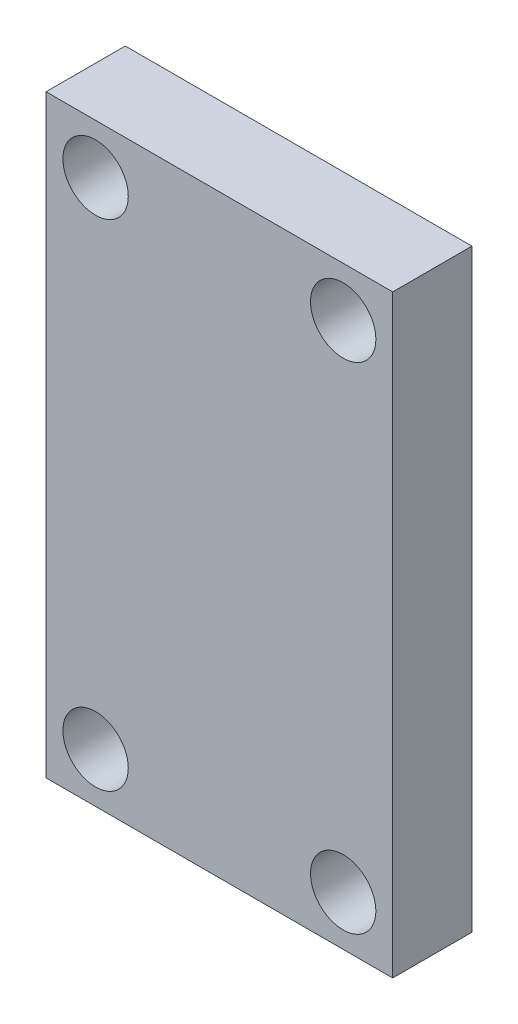
ISO-10303-21;
HEADER;
FILE_DESCRIPTION(('STEP AP214'),'2;1');
FILE_NAME('part.step','',(''),(''),'','','');
FILE_SCHEMA(('AUTOMOTIVE_DESIGN { 1 0 10303 214 1 1 1 1 }'));
ENDSEC;
DATA;
#1=APPLICATION_CONTEXT('core data for automotive mechanical design processes');
#2=APPLICATION_PROTOCOL_DEFINITION('international standard','automotive_design',2000,#1);
#3=PRODUCT_CONTEXT('',#1,'mechanical');
#4=PRODUCT('Part','Part','',(#3));
#5=PRODUCT_RELATED_PRODUCT_CATEGORY('part','',(#4));
#6=PRODUCT_DEFINITION_FORMATION('','',#4);
#7=PRODUCT_DEFINITION_CONTEXT('part definition',#1,'design');
#8=PRODUCT_DEFINITION('design','',#6,#7);
#9=PRODUCT_DEFINITION_SHAPE('','',#8);
#10=(LENGTH_UNIT() NAMED_UNIT(*) SI_UNIT(.MILLI.,.METRE.));
#11=(NAMED_UNIT(*) PLANE_ANGLE_UNIT() SI_UNIT($,.RADIAN.));
#12=(NAMED_UNIT(*) SI_UNIT($,.STERADIAN.) SOLID_ANGLE_UNIT());
#13=UNCERTAINTY_MEASURE_WITH_UNIT(LENGTH_MEASURE(1.E-05),#10,'distance_accuracy_value','');
#14=(GEOMETRIC_REPRESENTATION_CONTEXT(3) GLOBAL_UNCERTAINTY_ASSIGNED_CONTEXT((#13)) GLOBAL_UNIT_ASSIGNED_CONTEXT((#10,
#11,#12)) REPRESENTATION_CONTEXT('',''));
#15=CARTESIAN_POINT('',(0.,0.,0.));
#16=DIRECTION('',(0.,0.,1.));
#17=DIRECTION('',(1.,0.,0.));
#18=AXIS2_PLACEMENT_3D('',#15,#16,#17);
#19=CARTESIAN_POINT('',(17.5,30.,4.));
#20=DIRECTION('',(-1.,0.,0.));
#21=DIRECTION('',(0.,0.,1.));
#22=AXIS2_PLACEMENT_3D('',#19,#20,#21);
#23=PLANE('',#22);
#24=DIRECTION('',(0.,1.,0.));
#25=VECTOR('',#24,1.);
#26=CARTESIAN_POINT('',(17.5,30.,-4.));
#27=LINE('',#26,#25);
#28=CARTESIAN_POINT('',(17.5,-30.,-4.));
#29=VERTEX_POINT('',#28);
#30=CARTESIAN_POINT('',(17.5,30.,-4.));
#31=VERTEX_POINT('',#30);
#32=EDGE_CURVE('E104',#29,#31,#27,.T.);
#33=ORIENTED_EDGE('',*,*,#32,.T.);
#34=DIRECTION('',(0.,0.,-1.));
#35=VECTOR('',#34,1.);
#36=CARTESIAN_POINT('',(17.5,30.,4.));
#37=LINE('',#36,#35);
#38=CARTESIAN_POINT('',(17.5,30.,4.));
#39=VERTEX_POINT('',#38);
#40=EDGE_CURVE('E11',#39,#31,#37,.T.);
#41=ORIENTED_EDGE('',*,*,#40,.F.);
#42=DIRECTION('',(0.,1.,0.));
#43=VECTOR('',#42,1.);
#44=CARTESIAN_POINT('',(17.5,30.,4.));
#45=LINE('',#44,#43);
#46=CARTESIAN_POINT('',(17.5,-30.,4.));
#47=VERTEX_POINT('',#46);
#48=EDGE_CURVE('E92',#47,#39,#45,.T.);
#49=ORIENTED_EDGE('',*,*,#48,.F.);
#50=DIRECTION('',(0.,0.,-1.));
#51=VECTOR('',#50,1.);
#52=CARTESIAN_POINT('',(17.5,-30.,4.));
#53=LINE('',#52,#51);
#54=EDGE_CURVE('E100',#47,#29,#53,.T.);
#55=ORIENTED_EDGE('',*,*,#54,.T.);
#56=EDGE_LOOP('',(#33,#41,#49,#55));
#57=FACE_BOUND('',#56,.T.);
#58=ADVANCED_FACE('F41',(#57),#23,.F.);
#59=CARTESIAN_POINT('',(-17.5,30.,4.));
#60=DIRECTION('',(0.,-1.,0.));
#61=DIRECTION('',(0.,0.,-1.));
#62=AXIS2_PLACEMENT_3D('',#59,#60,#61);
#63=PLANE('',#62);
#64=DIRECTION('',(-1.,0.,0.));
#65=VECTOR('',#64,1.);
#66=CARTESIAN_POINT('',(-17.5,30.,-4.));
#67=LINE('',#66,#65);
#68=CARTESIAN_POINT('',(-17.5,30.,-4.));
#69=VERTEX_POINT('',#68);
#70=EDGE_CURVE('E96',#31,#69,#67,.T.);
#71=ORIENTED_EDGE('',*,*,#70,.T.);
#72=DIRECTION('',(0.,0.,-1.));
#73=VECTOR('',#72,1.);
#74=CARTESIAN_POINT('',(-17.5,30.,4.));
#75=LINE('',#74,#73);
#76=CARTESIAN_POINT('',(-17.5,30.,4.));
#77=VERTEX_POINT('',#76);
#78=EDGE_CURVE('E49',#77,#69,#75,.T.);
#79=ORIENTED_EDGE('',*,*,#78,.F.);
#80=DIRECTION('',(-1.,0.,0.));
#81=VECTOR('',#80,1.);
#82=CARTESIAN_POINT('',(-17.5,30.,4.));
#83=LINE('',#82,#81);
#84=EDGE_CURVE('E87',#39,#77,#83,.T.);
#85=ORIENTED_EDGE('',*,*,#84,.F.);
#86=ORIENTED_EDGE('',*,*,#40,.T.);
#87=EDGE_LOOP('',(#71,#79,#85,#86));
#88=FACE_BOUND('',#87,.T.);
#89=ADVANCED_FACE('F95',(#88),#63,.F.);
#90=CARTESIAN_POINT('',(-17.5,30.,4.));
#91=DIRECTION('',(1.,0.,0.));
#92=DIRECTION('',(0.,0.,-1.));
#93=AXIS2_PLACEMENT_3D('',#90,#91,#92);
#94=PLANE('',#93);
#95=DIRECTION('',(0.,-1.,0.));
#96=VECTOR('',#95,1.);
#97=CARTESIAN_POINT('',(-17.5,30.,-4.));
#98=LINE('',#97,#96);
#99=CARTESIAN_POINT('',(-17.5,-30.,-4.));
#100=VERTEX_POINT('',#99);
#101=EDGE_CURVE('E74',#69,#100,#98,.T.);
#102=ORIENTED_EDGE('',*,*,#101,.T.);
#103=DIRECTION('',(0.,0.,-1.));
#104=VECTOR('',#103,1.);
#105=CARTESIAN_POINT('',(-17.5,-30.,4.));
#106=LINE('',#105,#104);
#107=CARTESIAN_POINT('',(-17.5,-30.,4.));
#108=VERTEX_POINT('',#107);
#109=EDGE_CURVE('E97',#108,#100,#106,.T.);
#110=ORIENTED_EDGE('',*,*,#109,.F.);
#111=DIRECTION('',(0.,-1.,0.));
#112=VECTOR('',#111,1.);
#113=CARTESIAN_POINT('',(-17.5,30.,4.));
#114=LINE('',#113,#112);
#115=EDGE_CURVE('E90',#77,#108,#114,.T.);
#116=ORIENTED_EDGE('',*,*,#115,.F.);
#117=ORIENTED_EDGE('',*,*,#78,.T.);
#118=EDGE_LOOP('',(#102,#110,#116,#117));
#119=FACE_BOUND('',#118,.T.);
#120=ADVANCED_FACE('F98',(#119),#94,.F.);
#121=CARTESIAN_POINT('',(-17.5,-30.,4.));
#122=DIRECTION('',(0.,1.,0.));
#123=DIRECTION('',(0.,0.,1.));
#124=AXIS2_PLACEMENT_3D('',#121,#122,#123);
#125=PLANE('',#124);
#126=DIRECTION('',(1.,0.,0.));
#127=VECTOR('',#126,1.);
#128=CARTESIAN_POINT('',(-17.5,-30.,-4.));
#129=LINE('',#128,#127);
#130=EDGE_CURVE('E80',#100,#29,#129,.T.);
#131=ORIENTED_EDGE('',*,*,#130,.T.);
#132=ORIENTED_EDGE('',*,*,#54,.F.);
#133=DIRECTION('',(1.,0.,0.));
#134=VECTOR('',#133,1.);
#135=CARTESIAN_POINT('',(-17.5,-30.,4.));
#136=LINE('',#135,#134);
#137=EDGE_CURVE('E57',#108,#47,#136,.T.);
#138=ORIENTED_EDGE('',*,*,#137,.F.);
#139=ORIENTED_EDGE('',*,*,#109,.T.);
#140=EDGE_LOOP('',(#131,#132,#138,#139));
#141=FACE_BOUND('',#140,.T.);
#142=ADVANCED_FACE('F112',(#141),#125,.F.);
#143=CARTESIAN_POINT('',(0.,0.,4.));
#144=DIRECTION('',(0.,0.,1.));
#145=DIRECTION('',(1.,0.,0.));
#146=AXIS2_PLACEMENT_3D('',#143,#144,#145);
#147=PLANE('',#146);
#148=CARTESIAN_POINT('',(-12.5,-25.,4.));
#149=DIRECTION('',(0.,0.,1.));
#150=DIRECTION('',(1.,0.,0.));
#151=AXIS2_PLACEMENT_3D('',#148,#149,#150);
#152=CIRCLE('',#151,3.3);
#153=CARTESIAN_POINT('',(-9.2,-25.,4.));
#154=VERTEX_POINT('',#153);
#155=EDGE_CURVE('E138',#154,#154,#152,.T.);
#156=ORIENTED_EDGE('',*,*,#155,.F.);
#157=EDGE_LOOP('',(#156));
#158=FACE_BOUND('',#157,.T.);
#159=CARTESIAN_POINT('',(12.5,-25.,4.));
#160=DIRECTION('',(0.,0.,1.));
#161=DIRECTION('',(1.,0.,0.));
#162=AXIS2_PLACEMENT_3D('',#159,#160,#161);
#163=CIRCLE('',#162,3.3);
#164=CARTESIAN_POINT('',(15.8,-25.,4.));
#165=VERTEX_POINT('',#164);
#166=EDGE_CURVE('E132',#165,#165,#163,.T.);
#167=ORIENTED_EDGE('',*,*,#166,.F.);
#168=EDGE_LOOP('',(#167));
#169=FACE_BOUND('',#168,.T.);
#170=CARTESIAN_POINT('',(12.5,25.,4.));
#171=DIRECTION('',(0.,0.,1.));
#172=DIRECTION('',(1.,0.,0.));
#173=AXIS2_PLACEMENT_3D('',#170,#171,#172);
#174=CIRCLE('',#173,3.3);
#175=CARTESIAN_POINT('',(15.8,25.,4.));
#176=VERTEX_POINT('',#175);
#177=EDGE_CURVE('E126',#176,#176,#174,.T.);
#178=ORIENTED_EDGE('',*,*,#177,.F.);
#179=EDGE_LOOP('',(#178));
#180=FACE_BOUND('',#179,.T.);
#181=CARTESIAN_POINT('',(-12.5,25.,4.));
#182=DIRECTION('',(0.,0.,1.));
#183=DIRECTION('',(1.,0.,0.));
#184=AXIS2_PLACEMENT_3D('',#181,#182,#183);
#185=CIRCLE('',#184,3.3);
#186=CARTESIAN_POINT('',(-9.2,25.,4.));
#187=VERTEX_POINT('',#186);
#188=EDGE_CURVE('E120',#187,#187,#185,.T.);
#189=ORIENTED_EDGE('',*,*,#188,.F.);
#190=EDGE_LOOP('',(#189));
#191=FACE_BOUND('',#190,.T.);
#192=ORIENTED_EDGE('',*,*,#48,.T.);
#193=ORIENTED_EDGE('',*,*,#84,.T.);
#194=ORIENTED_EDGE('',*,*,#115,.T.);
#195=ORIENTED_EDGE('',*,*,#137,.T.);
#196=EDGE_LOOP('',(#192,#193,#194,#195));
#197=FACE_BOUND('',#196,.T.);
#198=ADVANCED_FACE('F88',(#158,#169,#180,#191,#197),#147,.T.);
#199=CARTESIAN_POINT('',(0.,0.,-4.));
#200=DIRECTION('',(0.,0.,1.));
#201=DIRECTION('',(1.,0.,0.));
#202=AXIS2_PLACEMENT_3D('',#199,#200,#201);
#203=PLANE('',#202);
#204=CARTESIAN_POINT('',(-12.5,-25.,-4.));
#205=DIRECTION('',(0.,0.,1.));
#206=DIRECTION('',(1.,0.,0.));
#207=AXIS2_PLACEMENT_3D('',#204,#205,#206);
#208=CIRCLE('',#207,3.3);
#209=CARTESIAN_POINT('',(-9.2,-25.,-4.));
#210=VERTEX_POINT('',#209);
#211=EDGE_CURVE('E135',#210,#210,#208,.T.);
#212=ORIENTED_EDGE('',*,*,#211,.T.);
#213=EDGE_LOOP('',(#212));
#214=FACE_BOUND('',#213,.T.);
#215=CARTESIAN_POINT('',(12.5,-25.,-4.));
#216=DIRECTION('',(0.,0.,1.));
#217=DIRECTION('',(1.,0.,0.));
#218=AXIS2_PLACEMENT_3D('',#215,#216,#217);
#219=CIRCLE('',#218,3.3);
#220=CARTESIAN_POINT('',(15.8,-25.,-4.));
#221=VERTEX_POINT('',#220);
#222=EDGE_CURVE('E129',#221,#221,#219,.T.);
#223=ORIENTED_EDGE('',*,*,#222,.T.);
#224=EDGE_LOOP('',(#223));
#225=FACE_BOUND('',#224,.T.);
#226=CARTESIAN_POINT('',(12.5,25.,-4.));
#227=DIRECTION('',(0.,0.,1.));
#228=DIRECTION('',(1.,0.,0.));
#229=AXIS2_PLACEMENT_3D('',#226,#227,#228);
#230=CIRCLE('',#229,3.3);
#231=CARTESIAN_POINT('',(15.8,25.,-4.));
#232=VERTEX_POINT('',#231);
#233=EDGE_CURVE('E123',#232,#232,#230,.T.);
#234=ORIENTED_EDGE('',*,*,#233,.T.);
#235=EDGE_LOOP('',(#234));
#236=FACE_BOUND('',#235,.T.);
#237=CARTESIAN_POINT('',(-12.5,25.,-4.));
#238=DIRECTION('',(0.,0.,1.));
#239=DIRECTION('',(1.,0.,0.));
#240=AXIS2_PLACEMENT_3D('',#237,#238,#239);
#241=CIRCLE('',#240,3.3);
#242=CARTESIAN_POINT('',(-9.2,25.,-4.));
#243=VERTEX_POINT('',#242);
#244=EDGE_CURVE('E107',#243,#243,#241,.T.);
#245=ORIENTED_EDGE('',*,*,#244,.T.);
#246=EDGE_LOOP('',(#245));
#247=FACE_BOUND('',#246,.T.);
#248=ORIENTED_EDGE('',*,*,#32,.F.);
#249=ORIENTED_EDGE('',*,*,#130,.F.);
#250=ORIENTED_EDGE('',*,*,#101,.F.);
#251=ORIENTED_EDGE('',*,*,#70,.F.);
#252=EDGE_LOOP('',(#248,#249,#250,#251));
#253=FACE_BOUND('',#252,.T.);
#254=ADVANCED_FACE('F115',(#214,#225,#236,#247,#253),#203,.F.);
#255=CARTESIAN_POINT('',(-12.5,25.,4.));
#256=DIRECTION('',(0.,0.,1.));
#257=DIRECTION('',(1.,0.,0.));
#258=AXIS2_PLACEMENT_3D('',#255,#256,#257);
#259=CYLINDRICAL_SURFACE('',#258,3.3);
#260=ORIENTED_EDGE('',*,*,#244,.F.);
#261=EDGE_LOOP('',(#260));
#262=FACE_BOUND('',#261,.T.);
#263=ORIENTED_EDGE('',*,*,#188,.T.);
#264=EDGE_LOOP('',(#263));
#265=FACE_BOUND('',#264,.T.);
#266=ADVANCED_FACE('F153',(#262,#265),#259,.F.);
#267=CARTESIAN_POINT('',(12.5,25.,4.));
#268=DIRECTION('',(0.,0.,1.));
#269=DIRECTION('',(1.,0.,0.));
#270=AXIS2_PLACEMENT_3D('',#267,#268,#269);
#271=CYLINDRICAL_SURFACE('',#270,3.3);
#272=ORIENTED_EDGE('',*,*,#233,.F.);
#273=EDGE_LOOP('',(#272));
#274=FACE_BOUND('',#273,.T.);
#275=ORIENTED_EDGE('',*,*,#177,.T.);
#276=EDGE_LOOP('',(#275));
#277=FACE_BOUND('',#276,.T.);
#278=ADVANCED_FACE('F155',(#274,#277),#271,.F.);
#279=CARTESIAN_POINT('',(12.5,-25.,4.));
#280=DIRECTION('',(0.,0.,1.));
#281=DIRECTION('',(1.,0.,0.));
#282=AXIS2_PLACEMENT_3D('',#279,#280,#281);
#283=CYLINDRICAL_SURFACE('',#282,3.3);
#284=ORIENTED_EDGE('',*,*,#222,.F.);
#285=EDGE_LOOP('',(#284));
#286=FACE_BOUND('',#285,.T.);
#287=ORIENTED_EDGE('',*,*,#166,.T.);
#288=EDGE_LOOP('',(#287));
#289=FACE_BOUND('',#288,.T.);
#290=ADVANCED_FACE('F162',(#286,#289),#283,.F.);
#291=CARTESIAN_POINT('',(-12.5,-25.,4.));
#292=DIRECTION('',(0.,0.,1.));
#293=DIRECTION('',(1.,0.,0.));
#294=AXIS2_PLACEMENT_3D('',#291,#292,#293);
#295=CYLINDRICAL_SURFACE('',#294,3.3);
#296=ORIENTED_EDGE('',*,*,#211,.F.);
#297=EDGE_LOOP('',(#296));
#298=FACE_BOUND('',#297,.T.);
#299=ORIENTED_EDGE('',*,*,#155,.T.);
#300=EDGE_LOOP('',(#299));
#301=FACE_BOUND('',#300,.T.);
#302=ADVANCED_FACE('F142',(#298,#301),#295,.F.);
#303=CLOSED_SHELL('',(#58,#89,#120,#142,#198,#254,#266,#278,#290,#302));
#304=MANIFOLD_SOLID_BREP('B2',#303);
#305=ADVANCED_BREP_SHAPE_REPRESENTATION('',(#18,#304),#14);
#306=SHAPE_DEFINITION_REPRESENTATION(#9,#305);
ENDSEC;
END-ISO-10303-21;
